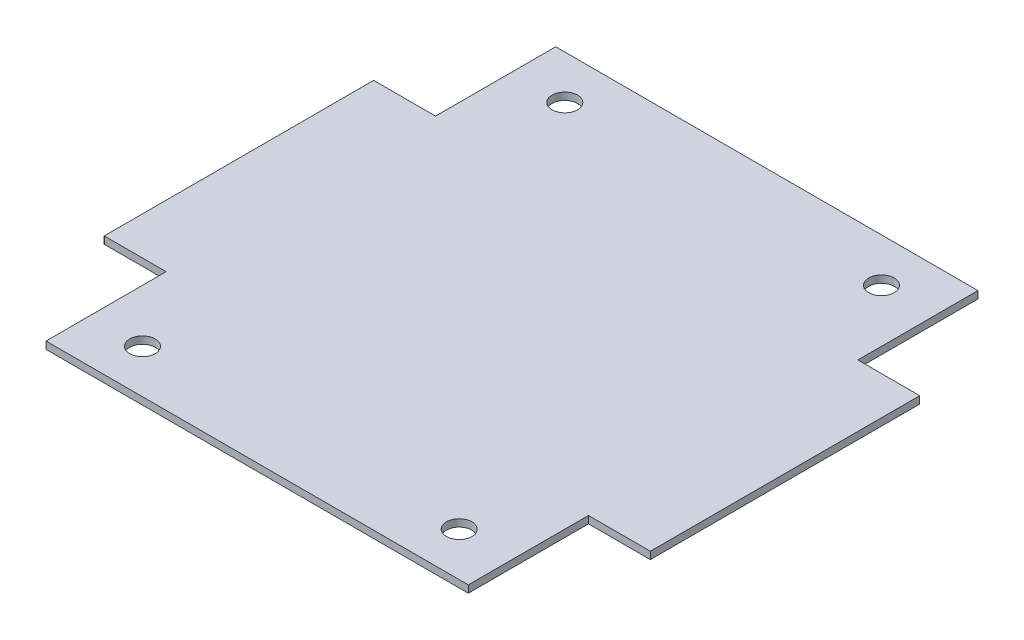
ISO-10303-21;
HEADER;
FILE_DESCRIPTION(('STEP AP214'),'2;1');
FILE_NAME('part.step','',(''),(''),'','','');
FILE_SCHEMA(('AUTOMOTIVE_DESIGN { 1 0 10303 214 1 1 1 1 }'));
ENDSEC;
DATA;
#1=APPLICATION_CONTEXT('core data for automotive mechanical design processes');
#2=APPLICATION_PROTOCOL_DEFINITION('international standard','automotive_design',2000,#1);
#3=PRODUCT_CONTEXT('',#1,'mechanical');
#4=PRODUCT('Part','Part','',(#3));
#5=PRODUCT_RELATED_PRODUCT_CATEGORY('part','',(#4));
#6=PRODUCT_DEFINITION_FORMATION('','',#4);
#7=PRODUCT_DEFINITION_CONTEXT('part definition',#1,'design');
#8=PRODUCT_DEFINITION('design','',#6,#7);
#9=PRODUCT_DEFINITION_SHAPE('','',#8);
#10=(LENGTH_UNIT() NAMED_UNIT(*) SI_UNIT(.MILLI.,.METRE.));
#11=(NAMED_UNIT(*) PLANE_ANGLE_UNIT() SI_UNIT($,.RADIAN.));
#12=(NAMED_UNIT(*) SI_UNIT($,.STERADIAN.) SOLID_ANGLE_UNIT());
#13=UNCERTAINTY_MEASURE_WITH_UNIT(LENGTH_MEASURE(1.E-05),#10,'distance_accuracy_value','');
#14=(GEOMETRIC_REPRESENTATION_CONTEXT(3) GLOBAL_UNCERTAINTY_ASSIGNED_CONTEXT((#13)) GLOBAL_UNIT_ASSIGNED_CONTEXT((#10,
#11,#12)) REPRESENTATION_CONTEXT('',''));
#15=CARTESIAN_POINT('',(0.,0.,0.));
#16=DIRECTION('',(0.,0.,1.));
#17=DIRECTION('',(1.,0.,0.));
#18=AXIS2_PLACEMENT_3D('',#15,#16,#17);
#19=CARTESIAN_POINT('',(-37.5,1.,18.5));
#20=DIRECTION('',(1.,0.,0.));
#21=DIRECTION('',(0.,0.,-1.));
#22=AXIS2_PLACEMENT_3D('',#19,#20,#21);
#23=PLANE('',#22);
#24=DIRECTION('',(0.,0.,1.));
#25=VECTOR('',#24,1.);
#26=CARTESIAN_POINT('',(-37.5,0.,18.5));
#27=LINE('',#26,#25);
#28=CARTESIAN_POINT('',(-37.5,0.,-18.5));
#29=VERTEX_POINT('',#28);
#30=CARTESIAN_POINT('',(-37.5,0.,18.5));
#31=VERTEX_POINT('',#30);
#32=EDGE_CURVE('E153',#29,#31,#27,.T.);
#33=ORIENTED_EDGE('',*,*,#32,.T.);
#34=DIRECTION('',(0.,-1.,0.));
#35=VECTOR('',#34,1.);
#36=CARTESIAN_POINT('',(-37.5,1.,18.5));
#37=LINE('',#36,#35);
#38=CARTESIAN_POINT('',(-37.5,1.,18.5));
#39=VERTEX_POINT('',#38);
#40=EDGE_CURVE('E11',#39,#31,#37,.T.);
#41=ORIENTED_EDGE('',*,*,#40,.F.);
#42=DIRECTION('',(0.,0.,1.));
#43=VECTOR('',#42,1.);
#44=CARTESIAN_POINT('',(-37.5,1.,18.5));
#45=LINE('',#44,#43);
#46=CARTESIAN_POINT('',(-37.5,1.,-18.5));
#47=VERTEX_POINT('',#46);
#48=EDGE_CURVE('E176',#47,#39,#45,.T.);
#49=ORIENTED_EDGE('',*,*,#48,.F.);
#50=DIRECTION('',(0.,-1.,0.));
#51=VECTOR('',#50,1.);
#52=CARTESIAN_POINT('',(-37.5,1.,-18.5));
#53=LINE('',#52,#51);
#54=EDGE_CURVE('E149',#47,#29,#53,.T.);
#55=ORIENTED_EDGE('',*,*,#54,.T.);
#56=EDGE_LOOP('',(#33,#41,#49,#55));
#57=FACE_BOUND('',#56,.T.);
#58=ADVANCED_FACE('F33',(#57),#23,.F.);
#59=CARTESIAN_POINT('',(-29.,1.,18.5));
#60=DIRECTION('',(0.,0.,-1.));
#61=DIRECTION('',(-1.,0.,0.));
#62=AXIS2_PLACEMENT_3D('',#59,#60,#61);
#63=PLANE('',#62);
#64=DIRECTION('',(1.,0.,0.));
#65=VECTOR('',#64,1.);
#66=CARTESIAN_POINT('',(-29.,0.,18.5));
#67=LINE('',#66,#65);
#68=CARTESIAN_POINT('',(-29.,0.,18.5));
#69=VERTEX_POINT('',#68);
#70=EDGE_CURVE('E156',#31,#69,#67,.T.);
#71=ORIENTED_EDGE('',*,*,#70,.T.);
#72=DIRECTION('',(0.,-1.,0.));
#73=VECTOR('',#72,1.);
#74=CARTESIAN_POINT('',(-29.,1.,18.5));
#75=LINE('',#74,#73);
#76=CARTESIAN_POINT('',(-29.,1.,18.5));
#77=VERTEX_POINT('',#76);
#78=EDGE_CURVE('E41',#77,#69,#75,.T.);
#79=ORIENTED_EDGE('',*,*,#78,.F.);
#80=DIRECTION('',(1.,0.,0.));
#81=VECTOR('',#80,1.);
#82=CARTESIAN_POINT('',(-29.,1.,18.5));
#83=LINE('',#82,#81);
#84=EDGE_CURVE('E104',#39,#77,#83,.T.);
#85=ORIENTED_EDGE('',*,*,#84,.F.);
#86=ORIENTED_EDGE('',*,*,#40,.T.);
#87=EDGE_LOOP('',(#71,#79,#85,#86));
#88=FACE_BOUND('',#87,.T.);
#89=ADVANCED_FACE('F255',(#88),#63,.F.);
#90=CARTESIAN_POINT('',(-29.,1.,35.));
#91=DIRECTION('',(1.,0.,0.));
#92=DIRECTION('',(0.,0.,-1.));
#93=AXIS2_PLACEMENT_3D('',#90,#91,#92);
#94=PLANE('',#93);
#95=DIRECTION('',(0.,0.,1.));
#96=VECTOR('',#95,1.);
#97=CARTESIAN_POINT('',(-29.,0.,35.));
#98=LINE('',#97,#96);
#99=CARTESIAN_POINT('',(-29.,0.,35.));
#100=VERTEX_POINT('',#99);
#101=EDGE_CURVE('E159',#69,#100,#98,.T.);
#102=ORIENTED_EDGE('',*,*,#101,.T.);
#103=DIRECTION('',(0.,-1.,0.));
#104=VECTOR('',#103,1.);
#105=CARTESIAN_POINT('',(-29.,1.,35.));
#106=LINE('',#105,#104);
#107=CARTESIAN_POINT('',(-29.,1.,35.));
#108=VERTEX_POINT('',#107);
#109=EDGE_CURVE('E195',#108,#100,#106,.T.);
#110=ORIENTED_EDGE('',*,*,#109,.F.);
#111=DIRECTION('',(0.,0.,1.));
#112=VECTOR('',#111,1.);
#113=CARTESIAN_POINT('',(-29.,1.,35.));
#114=LINE('',#113,#112);
#115=EDGE_CURVE('E203',#77,#108,#114,.T.);
#116=ORIENTED_EDGE('',*,*,#115,.F.);
#117=ORIENTED_EDGE('',*,*,#78,.T.);
#118=EDGE_LOOP('',(#102,#110,#116,#117));
#119=FACE_BOUND('',#118,.T.);
#120=ADVANCED_FACE('F201',(#119),#94,.F.);
#121=CARTESIAN_POINT('',(29.,1.,35.));
#122=DIRECTION('',(0.,0.,-1.));
#123=DIRECTION('',(-1.,0.,0.));
#124=AXIS2_PLACEMENT_3D('',#121,#122,#123);
#125=PLANE('',#124);
#126=DIRECTION('',(1.,0.,0.));
#127=VECTOR('',#126,1.);
#128=CARTESIAN_POINT('',(29.,0.,35.));
#129=LINE('',#128,#127);
#130=CARTESIAN_POINT('',(29.,0.,35.));
#131=VERTEX_POINT('',#130);
#132=EDGE_CURVE('E161',#100,#131,#129,.T.);
#133=ORIENTED_EDGE('',*,*,#132,.T.);
#134=DIRECTION('',(0.,-1.,0.));
#135=VECTOR('',#134,1.);
#136=CARTESIAN_POINT('',(29.,1.,35.));
#137=LINE('',#136,#135);
#138=CARTESIAN_POINT('',(29.,1.,35.));
#139=VERTEX_POINT('',#138);
#140=EDGE_CURVE('E192',#139,#131,#137,.T.);
#141=ORIENTED_EDGE('',*,*,#140,.F.);
#142=DIRECTION('',(1.,0.,0.));
#143=VECTOR('',#142,1.);
#144=CARTESIAN_POINT('',(29.,1.,35.));
#145=LINE('',#144,#143);
#146=EDGE_CURVE('E221',#108,#139,#145,.T.);
#147=ORIENTED_EDGE('',*,*,#146,.F.);
#148=ORIENTED_EDGE('',*,*,#109,.T.);
#149=EDGE_LOOP('',(#133,#141,#147,#148));
#150=FACE_BOUND('',#149,.T.);
#151=ADVANCED_FACE('F212',(#150),#125,.F.);
#152=CARTESIAN_POINT('',(29.,1.,18.5));
#153=DIRECTION('',(-1.,0.,0.));
#154=DIRECTION('',(0.,0.,1.));
#155=AXIS2_PLACEMENT_3D('',#152,#153,#154);
#156=PLANE('',#155);
#157=DIRECTION('',(0.,0.,-1.));
#158=VECTOR('',#157,1.);
#159=CARTESIAN_POINT('',(29.,0.,18.5));
#160=LINE('',#159,#158);
#161=CARTESIAN_POINT('',(29.,0.,18.5));
#162=VERTEX_POINT('',#161);
#163=EDGE_CURVE('E163',#131,#162,#160,.T.);
#164=ORIENTED_EDGE('',*,*,#163,.T.);
#165=DIRECTION('',(0.,-1.,0.));
#166=VECTOR('',#165,1.);
#167=CARTESIAN_POINT('',(29.,1.,18.5));
#168=LINE('',#167,#166);
#169=CARTESIAN_POINT('',(29.,1.,18.5));
#170=VERTEX_POINT('',#169);
#171=EDGE_CURVE('E189',#170,#162,#168,.T.);
#172=ORIENTED_EDGE('',*,*,#171,.F.);
#173=DIRECTION('',(0.,0.,-1.));
#174=VECTOR('',#173,1.);
#175=CARTESIAN_POINT('',(29.,1.,18.5));
#176=LINE('',#175,#174);
#177=EDGE_CURVE('E218',#139,#170,#176,.T.);
#178=ORIENTED_EDGE('',*,*,#177,.F.);
#179=ORIENTED_EDGE('',*,*,#140,.T.);
#180=EDGE_LOOP('',(#164,#172,#178,#179));
#181=FACE_BOUND('',#180,.T.);
#182=ADVANCED_FACE('F216',(#181),#156,.F.);
#183=CARTESIAN_POINT('',(37.5,1.,18.5));
#184=DIRECTION('',(0.,0.,-1.));
#185=DIRECTION('',(-1.,0.,0.));
#186=AXIS2_PLACEMENT_3D('',#183,#184,#185);
#187=PLANE('',#186);
#188=DIRECTION('',(1.,0.,0.));
#189=VECTOR('',#188,1.);
#190=CARTESIAN_POINT('',(37.5,0.,18.5));
#191=LINE('',#190,#189);
#192=CARTESIAN_POINT('',(37.5,0.,18.5));
#193=VERTEX_POINT('',#192);
#194=EDGE_CURVE('E165',#162,#193,#191,.T.);
#195=ORIENTED_EDGE('',*,*,#194,.T.);
#196=DIRECTION('',(0.,-1.,0.));
#197=VECTOR('',#196,1.);
#198=CARTESIAN_POINT('',(37.5,1.,18.5));
#199=LINE('',#198,#197);
#200=CARTESIAN_POINT('',(37.5,1.,18.5));
#201=VERTEX_POINT('',#200);
#202=EDGE_CURVE('E186',#201,#193,#199,.T.);
#203=ORIENTED_EDGE('',*,*,#202,.F.);
#204=DIRECTION('',(1.,0.,0.));
#205=VECTOR('',#204,1.);
#206=CARTESIAN_POINT('',(37.5,1.,18.5));
#207=LINE('',#206,#205);
#208=EDGE_CURVE('E220',#170,#201,#207,.T.);
#209=ORIENTED_EDGE('',*,*,#208,.F.);
#210=ORIENTED_EDGE('',*,*,#171,.T.);
#211=EDGE_LOOP('',(#195,#203,#209,#210));
#212=FACE_BOUND('',#211,.T.);
#213=ADVANCED_FACE('F268',(#212),#187,.F.);
#214=CARTESIAN_POINT('',(37.5,1.,-18.5));
#215=DIRECTION('',(-1.,0.,0.));
#216=DIRECTION('',(0.,0.,1.));
#217=AXIS2_PLACEMENT_3D('',#214,#215,#216);
#218=PLANE('',#217);
#219=DIRECTION('',(0.,0.,-1.));
#220=VECTOR('',#219,1.);
#221=CARTESIAN_POINT('',(37.5,0.,-18.5));
#222=LINE('',#221,#220);
#223=CARTESIAN_POINT('',(37.5,0.,-18.5));
#224=VERTEX_POINT('',#223);
#225=EDGE_CURVE('E167',#193,#224,#222,.T.);
#226=ORIENTED_EDGE('',*,*,#225,.T.);
#227=DIRECTION('',(0.,-1.,0.));
#228=VECTOR('',#227,1.);
#229=CARTESIAN_POINT('',(37.5,1.,-18.5));
#230=LINE('',#229,#228);
#231=CARTESIAN_POINT('',(37.5,1.,-18.5));
#232=VERTEX_POINT('',#231);
#233=EDGE_CURVE('E183',#232,#224,#230,.T.);
#234=ORIENTED_EDGE('',*,*,#233,.F.);
#235=DIRECTION('',(0.,0.,-1.));
#236=VECTOR('',#235,1.);
#237=CARTESIAN_POINT('',(37.5,1.,-18.5));
#238=LINE('',#237,#236);
#239=EDGE_CURVE('E223',#201,#232,#238,.T.);
#240=ORIENTED_EDGE('',*,*,#239,.F.);
#241=ORIENTED_EDGE('',*,*,#202,.T.);
#242=EDGE_LOOP('',(#226,#234,#240,#241));
#243=FACE_BOUND('',#242,.T.);
#244=ADVANCED_FACE('F271',(#243),#218,.F.);
#245=CARTESIAN_POINT('',(29.,1.,-18.5));
#246=DIRECTION('',(0.,0.,1.));
#247=DIRECTION('',(1.,0.,0.));
#248=AXIS2_PLACEMENT_3D('',#245,#246,#247);
#249=PLANE('',#248);
#250=DIRECTION('',(-1.,0.,0.));
#251=VECTOR('',#250,1.);
#252=CARTESIAN_POINT('',(29.,0.,-18.5));
#253=LINE('',#252,#251);
#254=CARTESIAN_POINT('',(29.,0.,-18.5));
#255=VERTEX_POINT('',#254);
#256=EDGE_CURVE('E169',#224,#255,#253,.T.);
#257=ORIENTED_EDGE('',*,*,#256,.T.);
#258=DIRECTION('',(0.,-1.,0.));
#259=VECTOR('',#258,1.);
#260=CARTESIAN_POINT('',(29.,1.,-18.5));
#261=LINE('',#260,#259);
#262=CARTESIAN_POINT('',(29.,1.,-18.5));
#263=VERTEX_POINT('',#262);
#264=EDGE_CURVE('E180',#263,#255,#261,.T.);
#265=ORIENTED_EDGE('',*,*,#264,.F.);
#266=DIRECTION('',(-1.,0.,0.));
#267=VECTOR('',#266,1.);
#268=CARTESIAN_POINT('',(29.,1.,-18.5));
#269=LINE('',#268,#267);
#270=EDGE_CURVE('E229',#232,#263,#269,.T.);
#271=ORIENTED_EDGE('',*,*,#270,.F.);
#272=ORIENTED_EDGE('',*,*,#233,.T.);
#273=EDGE_LOOP('',(#257,#265,#271,#272));
#274=FACE_BOUND('',#273,.T.);
#275=ADVANCED_FACE('F235',(#274),#249,.F.);
#276=CARTESIAN_POINT('',(29.,1.,-35.));
#277=DIRECTION('',(-1.,0.,0.));
#278=DIRECTION('',(0.,0.,1.));
#279=AXIS2_PLACEMENT_3D('',#276,#277,#278);
#280=PLANE('',#279);
#281=DIRECTION('',(0.,0.,-1.));
#282=VECTOR('',#281,1.);
#283=CARTESIAN_POINT('',(29.,0.,-35.));
#284=LINE('',#283,#282);
#285=CARTESIAN_POINT('',(29.,0.,-35.));
#286=VERTEX_POINT('',#285);
#287=EDGE_CURVE('E171',#255,#286,#284,.T.);
#288=ORIENTED_EDGE('',*,*,#287,.T.);
#289=DIRECTION('',(0.,-1.,0.));
#290=VECTOR('',#289,1.);
#291=CARTESIAN_POINT('',(29.,1.,-35.));
#292=LINE('',#291,#290);
#293=CARTESIAN_POINT('',(29.,1.,-35.));
#294=VERTEX_POINT('',#293);
#295=EDGE_CURVE('E144',#294,#286,#292,.T.);
#296=ORIENTED_EDGE('',*,*,#295,.F.);
#297=DIRECTION('',(0.,0.,-1.));
#298=VECTOR('',#297,1.);
#299=CARTESIAN_POINT('',(29.,1.,-35.));
#300=LINE('',#299,#298);
#301=EDGE_CURVE('E135',#263,#294,#300,.T.);
#302=ORIENTED_EDGE('',*,*,#301,.F.);
#303=ORIENTED_EDGE('',*,*,#264,.T.);
#304=EDGE_LOOP('',(#288,#296,#302,#303));
#305=FACE_BOUND('',#304,.T.);
#306=ADVANCED_FACE('F239',(#305),#280,.F.);
#307=CARTESIAN_POINT('',(-29.,1.,-35.));
#308=DIRECTION('',(0.,0.,1.));
#309=DIRECTION('',(1.,0.,0.));
#310=AXIS2_PLACEMENT_3D('',#307,#308,#309);
#311=PLANE('',#310);
#312=DIRECTION('',(-1.,0.,0.));
#313=VECTOR('',#312,1.);
#314=CARTESIAN_POINT('',(-29.,0.,-35.));
#315=LINE('',#314,#313);
#316=CARTESIAN_POINT('',(-29.,0.,-35.));
#317=VERTEX_POINT('',#316);
#318=EDGE_CURVE('E143',#286,#317,#315,.T.);
#319=ORIENTED_EDGE('',*,*,#318,.T.);
#320=DIRECTION('',(0.,-1.,0.));
#321=VECTOR('',#320,1.);
#322=CARTESIAN_POINT('',(-29.,1.,-35.));
#323=LINE('',#322,#321);
#324=CARTESIAN_POINT('',(-29.,1.,-35.));
#325=VERTEX_POINT('',#324);
#326=EDGE_CURVE('E140',#325,#317,#323,.T.);
#327=ORIENTED_EDGE('',*,*,#326,.F.);
#328=DIRECTION('',(-1.,0.,0.));
#329=VECTOR('',#328,1.);
#330=CARTESIAN_POINT('',(-29.,1.,-35.));
#331=LINE('',#330,#329);
#332=EDGE_CURVE('E129',#294,#325,#331,.T.);
#333=ORIENTED_EDGE('',*,*,#332,.F.);
#334=ORIENTED_EDGE('',*,*,#295,.T.);
#335=EDGE_LOOP('',(#319,#327,#333,#334));
#336=FACE_BOUND('',#335,.T.);
#337=ADVANCED_FACE('F141',(#336),#311,.F.);
#338=CARTESIAN_POINT('',(-29.,1.,-18.5));
#339=DIRECTION('',(1.,0.,0.));
#340=DIRECTION('',(0.,0.,-1.));
#341=AXIS2_PLACEMENT_3D('',#338,#339,#340);
#342=PLANE('',#341);
#343=DIRECTION('',(0.,0.,1.));
#344=VECTOR('',#343,1.);
#345=CARTESIAN_POINT('',(-29.,0.,-18.5));
#346=LINE('',#345,#344);
#347=CARTESIAN_POINT('',(-29.,0.,-18.5));
#348=VERTEX_POINT('',#347);
#349=EDGE_CURVE('E90',#317,#348,#346,.T.);
#350=ORIENTED_EDGE('',*,*,#349,.T.);
#351=DIRECTION('',(0.,-1.,0.));
#352=VECTOR('',#351,1.);
#353=CARTESIAN_POINT('',(-29.,1.,-18.5));
#354=LINE('',#353,#352);
#355=CARTESIAN_POINT('',(-29.,1.,-18.5));
#356=VERTEX_POINT('',#355);
#357=EDGE_CURVE('E145',#356,#348,#354,.T.);
#358=ORIENTED_EDGE('',*,*,#357,.F.);
#359=DIRECTION('',(0.,0.,1.));
#360=VECTOR('',#359,1.);
#361=CARTESIAN_POINT('',(-29.,1.,-18.5));
#362=LINE('',#361,#360);
#363=EDGE_CURVE('E133',#325,#356,#362,.T.);
#364=ORIENTED_EDGE('',*,*,#363,.F.);
#365=ORIENTED_EDGE('',*,*,#326,.T.);
#366=EDGE_LOOP('',(#350,#358,#364,#365));
#367=FACE_BOUND('',#366,.T.);
#368=ADVANCED_FACE('F147',(#367),#342,.F.);
#369=CARTESIAN_POINT('',(-37.5,1.,-18.5));
#370=DIRECTION('',(0.,0.,1.));
#371=DIRECTION('',(1.,0.,0.));
#372=AXIS2_PLACEMENT_3D('',#369,#370,#371);
#373=PLANE('',#372);
#374=DIRECTION('',(-1.,0.,0.));
#375=VECTOR('',#374,1.);
#376=CARTESIAN_POINT('',(-37.5,0.,-18.5));
#377=LINE('',#376,#375);
#378=EDGE_CURVE('E96',#348,#29,#377,.T.);
#379=ORIENTED_EDGE('',*,*,#378,.T.);
#380=ORIENTED_EDGE('',*,*,#54,.F.);
#381=DIRECTION('',(-1.,0.,0.));
#382=VECTOR('',#381,1.);
#383=CARTESIAN_POINT('',(-37.5,1.,-18.5));
#384=LINE('',#383,#382);
#385=EDGE_CURVE('E49',#356,#47,#384,.T.);
#386=ORIENTED_EDGE('',*,*,#385,.F.);
#387=ORIENTED_EDGE('',*,*,#357,.T.);
#388=EDGE_LOOP('',(#379,#380,#386,#387));
#389=FACE_BOUND('',#388,.T.);
#390=ADVANCED_FACE('F243',(#389),#373,.F.);
#391=CARTESIAN_POINT('',(0.,1.,0.));
#392=DIRECTION('',(0.,-1.,0.));
#393=DIRECTION('',(0.,0.,-1.));
#394=AXIS2_PLACEMENT_3D('',#391,#392,#393);
#395=PLANE('',#394);
#396=CARTESIAN_POINT('',(-21.75,1.,29.));
#397=DIRECTION('',(0.,1.,0.));
#398=DIRECTION('',(0.,0.,1.));
#399=AXIS2_PLACEMENT_3D('',#396,#397,#398);
#400=CIRCLE('',#399,1.75);
#401=CARTESIAN_POINT('',(-21.75,1.,30.75));
#402=VERTEX_POINT('',#401);
#403=EDGE_CURVE('E354',#402,#402,#400,.T.);
#404=ORIENTED_EDGE('',*,*,#403,.F.);
#405=EDGE_LOOP('',(#404));
#406=FACE_BOUND('',#405,.T.);
#407=CARTESIAN_POINT('',(21.75,1.,29.));
#408=DIRECTION('',(0.,1.,0.));
#409=DIRECTION('',(0.,0.,1.));
#410=AXIS2_PLACEMENT_3D('',#407,#408,#409);
#411=CIRCLE('',#410,1.75);
#412=CARTESIAN_POINT('',(21.75,1.,30.75));
#413=VERTEX_POINT('',#412);
#414=EDGE_CURVE('E362',#413,#413,#411,.T.);
#415=ORIENTED_EDGE('',*,*,#414,.F.);
#416=EDGE_LOOP('',(#415));
#417=FACE_BOUND('',#416,.T.);
#418=CARTESIAN_POINT('',(21.75,1.,-29.));
#419=DIRECTION('',(0.,1.,0.));
#420=DIRECTION('',(0.,0.,1.));
#421=AXIS2_PLACEMENT_3D('',#418,#419,#420);
#422=CIRCLE('',#421,1.75);
#423=CARTESIAN_POINT('',(21.75,1.,-27.25));
#424=VERTEX_POINT('',#423);
#425=EDGE_CURVE('E368',#424,#424,#422,.T.);
#426=ORIENTED_EDGE('',*,*,#425,.F.);
#427=EDGE_LOOP('',(#426));
#428=FACE_BOUND('',#427,.T.);
#429=CARTESIAN_POINT('',(-21.75,1.,-29.));
#430=DIRECTION('',(0.,1.,0.));
#431=DIRECTION('',(0.,0.,1.));
#432=AXIS2_PLACEMENT_3D('',#429,#430,#431);
#433=CIRCLE('',#432,1.75);
#434=CARTESIAN_POINT('',(-21.75,1.,-27.25));
#435=VERTEX_POINT('',#434);
#436=EDGE_CURVE('E157',#435,#435,#433,.T.);
#437=ORIENTED_EDGE('',*,*,#436,.F.);
#438=EDGE_LOOP('',(#437));
#439=FACE_BOUND('',#438,.T.);
#440=ORIENTED_EDGE('',*,*,#48,.T.);
#441=ORIENTED_EDGE('',*,*,#84,.T.);
#442=ORIENTED_EDGE('',*,*,#115,.T.);
#443=ORIENTED_EDGE('',*,*,#146,.T.);
#444=ORIENTED_EDGE('',*,*,#177,.T.);
#445=ORIENTED_EDGE('',*,*,#208,.T.);
#446=ORIENTED_EDGE('',*,*,#239,.T.);
#447=ORIENTED_EDGE('',*,*,#270,.T.);
#448=ORIENTED_EDGE('',*,*,#301,.T.);
#449=ORIENTED_EDGE('',*,*,#332,.T.);
#450=ORIENTED_EDGE('',*,*,#363,.T.);
#451=ORIENTED_EDGE('',*,*,#385,.T.);
#452=EDGE_LOOP('',(#440,#441,#442,#443,#444,#445,#446,#447,#448,#449,#450,#451));
#453=FACE_BOUND('',#452,.T.);
#454=ADVANCED_FACE('F131',(#406,#417,#428,#439,#453),#395,.F.);
#455=CARTESIAN_POINT('',(0.,0.,0.));
#456=DIRECTION('',(0.,-1.,0.));
#457=DIRECTION('',(0.,0.,-1.));
#458=AXIS2_PLACEMENT_3D('',#455,#456,#457);
#459=PLANE('',#458);
#460=CARTESIAN_POINT('',(-21.75,0.,29.));
#461=DIRECTION('',(0.,1.,0.));
#462=DIRECTION('',(0.,0.,1.));
#463=AXIS2_PLACEMENT_3D('',#460,#461,#462);
#464=CIRCLE('',#463,1.75);
#465=CARTESIAN_POINT('',(-21.75,0.,30.75));
#466=VERTEX_POINT('',#465);
#467=EDGE_CURVE('E357',#466,#466,#464,.T.);
#468=ORIENTED_EDGE('',*,*,#467,.T.);
#469=EDGE_LOOP('',(#468));
#470=FACE_BOUND('',#469,.T.);
#471=CARTESIAN_POINT('',(21.75,0.,29.));
#472=DIRECTION('',(0.,1.,0.));
#473=DIRECTION('',(0.,0.,1.));
#474=AXIS2_PLACEMENT_3D('',#471,#472,#473);
#475=CIRCLE('',#474,1.75);
#476=CARTESIAN_POINT('',(21.75,0.,30.75));
#477=VERTEX_POINT('',#476);
#478=EDGE_CURVE('E359',#477,#477,#475,.T.);
#479=ORIENTED_EDGE('',*,*,#478,.T.);
#480=EDGE_LOOP('',(#479));
#481=FACE_BOUND('',#480,.T.);
#482=CARTESIAN_POINT('',(21.75,0.,-29.));
#483=DIRECTION('',(0.,1.,0.));
#484=DIRECTION('',(0.,0.,1.));
#485=AXIS2_PLACEMENT_3D('',#482,#483,#484);
#486=CIRCLE('',#485,1.75);
#487=CARTESIAN_POINT('',(21.75,0.,-27.25));
#488=VERTEX_POINT('',#487);
#489=EDGE_CURVE('E365',#488,#488,#486,.T.);
#490=ORIENTED_EDGE('',*,*,#489,.T.);
#491=EDGE_LOOP('',(#490));
#492=FACE_BOUND('',#491,.T.);
#493=CARTESIAN_POINT('',(-21.75,0.,-29.));
#494=DIRECTION('',(0.,1.,0.));
#495=DIRECTION('',(0.,0.,1.));
#496=AXIS2_PLACEMENT_3D('',#493,#494,#495);
#497=CIRCLE('',#496,1.75);
#498=CARTESIAN_POINT('',(-21.75,0.,-27.25));
#499=VERTEX_POINT('',#498);
#500=EDGE_CURVE('E371',#499,#499,#497,.T.);
#501=ORIENTED_EDGE('',*,*,#500,.T.);
#502=EDGE_LOOP('',(#501));
#503=FACE_BOUND('',#502,.T.);
#504=ORIENTED_EDGE('',*,*,#32,.F.);
#505=ORIENTED_EDGE('',*,*,#378,.F.);
#506=ORIENTED_EDGE('',*,*,#349,.F.);
#507=ORIENTED_EDGE('',*,*,#318,.F.);
#508=ORIENTED_EDGE('',*,*,#287,.F.);
#509=ORIENTED_EDGE('',*,*,#256,.F.);
#510=ORIENTED_EDGE('',*,*,#225,.F.);
#511=ORIENTED_EDGE('',*,*,#194,.F.);
#512=ORIENTED_EDGE('',*,*,#163,.F.);
#513=ORIENTED_EDGE('',*,*,#132,.F.);
#514=ORIENTED_EDGE('',*,*,#101,.F.);
#515=ORIENTED_EDGE('',*,*,#70,.F.);
#516=EDGE_LOOP('',(#504,#505,#506,#507,#508,#509,#510,#511,#512,#513,#514,#515));
#517=FACE_BOUND('',#516,.T.);
#518=ADVANCED_FACE('F207',(#470,#481,#492,#503,#517),#459,.T.);
#519=CARTESIAN_POINT('',(-21.75,1.,-29.));
#520=DIRECTION('',(0.,-1.,0.));
#521=DIRECTION('',(0.,0.,-1.));
#522=AXIS2_PLACEMENT_3D('',#519,#520,#521);
#523=CYLINDRICAL_SURFACE('',#522,1.75);
#524=ORIENTED_EDGE('',*,*,#436,.T.);
#525=EDGE_LOOP('',(#524));
#526=FACE_BOUND('',#525,.T.);
#527=ORIENTED_EDGE('',*,*,#500,.F.);
#528=EDGE_LOOP('',(#527));
#529=FACE_BOUND('',#528,.T.);
#530=ADVANCED_FACE('F308',(#526,#529),#523,.F.);
#531=CARTESIAN_POINT('',(21.75,1.,-29.));
#532=DIRECTION('',(0.,-1.,0.));
#533=DIRECTION('',(0.,0.,-1.));
#534=AXIS2_PLACEMENT_3D('',#531,#532,#533);
#535=CYLINDRICAL_SURFACE('',#534,1.75);
#536=ORIENTED_EDGE('',*,*,#425,.T.);
#537=EDGE_LOOP('',(#536));
#538=FACE_BOUND('',#537,.T.);
#539=ORIENTED_EDGE('',*,*,#489,.F.);
#540=EDGE_LOOP('',(#539));
#541=FACE_BOUND('',#540,.T.);
#542=ADVANCED_FACE('F317',(#538,#541),#535,.F.);
#543=CARTESIAN_POINT('',(21.75,1.,29.));
#544=DIRECTION('',(0.,-1.,0.));
#545=DIRECTION('',(0.,0.,-1.));
#546=AXIS2_PLACEMENT_3D('',#543,#544,#545);
#547=CYLINDRICAL_SURFACE('',#546,1.75);
#548=ORIENTED_EDGE('',*,*,#414,.T.);
#549=EDGE_LOOP('',(#548));
#550=FACE_BOUND('',#549,.T.);
#551=ORIENTED_EDGE('',*,*,#478,.F.);
#552=EDGE_LOOP('',(#551));
#553=FACE_BOUND('',#552,.T.);
#554=ADVANCED_FACE('F327',(#550,#553),#547,.F.);
#555=CARTESIAN_POINT('',(-21.75,1.,29.));
#556=DIRECTION('',(0.,-1.,0.));
#557=DIRECTION('',(0.,0.,-1.));
#558=AXIS2_PLACEMENT_3D('',#555,#556,#557);
#559=CYLINDRICAL_SURFACE('',#558,1.75);
#560=ORIENTED_EDGE('',*,*,#403,.T.);
#561=EDGE_LOOP('',(#560));
#562=FACE_BOUND('',#561,.T.);
#563=ORIENTED_EDGE('',*,*,#467,.F.);
#564=EDGE_LOOP('',(#563));
#565=FACE_BOUND('',#564,.T.);
#566=ADVANCED_FACE('F337',(#562,#565),#559,.F.);
#567=CLOSED_SHELL('',(#58,#89,#120,#151,#182,#213,#244,#275,#306,#337,#368,#390,#454,#518,#530,
#542,#554,#566));
#568=MANIFOLD_SOLID_BREP('B2',#567);
#569=ADVANCED_BREP_SHAPE_REPRESENTATION('',(#18,#568),#14);
#570=SHAPE_DEFINITION_REPRESENTATION(#9,#569);
ENDSEC;
END-ISO-10303-21;
